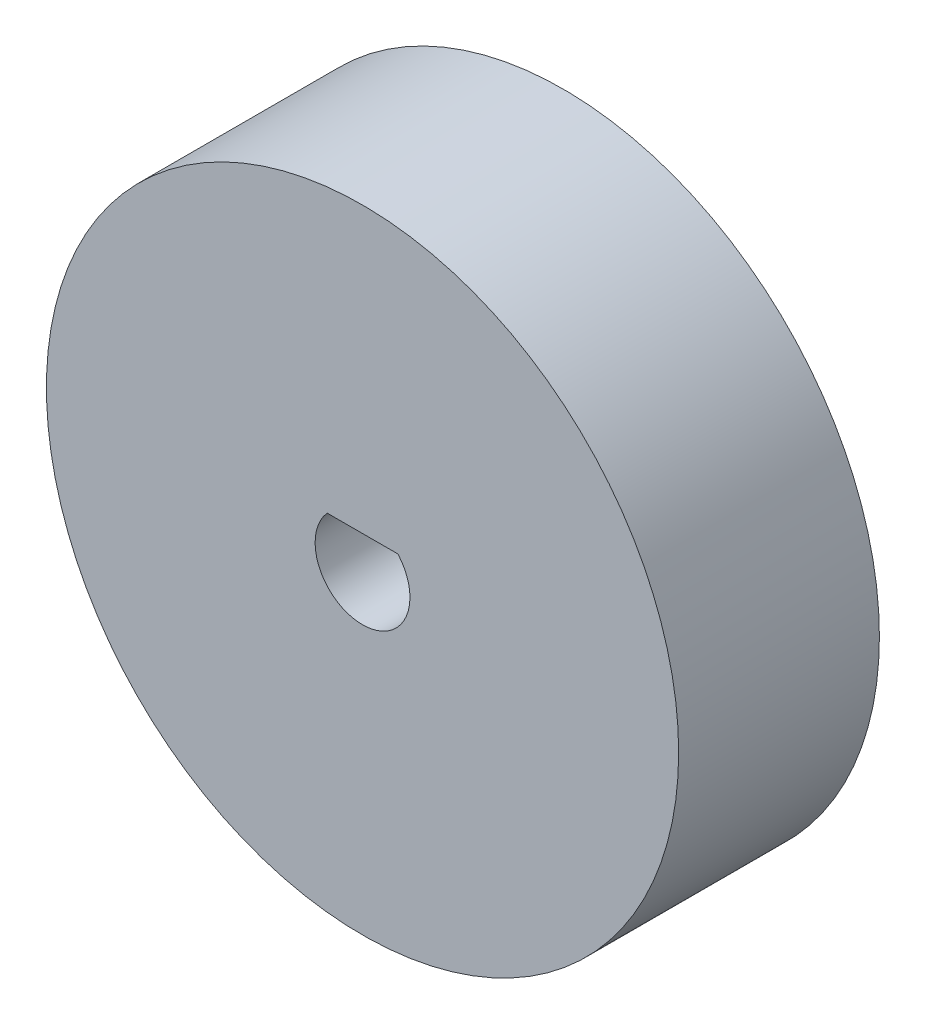
ISO-10303-21;
HEADER;
FILE_DESCRIPTION(('STEP AP214'),'2;1');
FILE_NAME('part.step','',(''),(''),'','','');
FILE_SCHEMA(('AUTOMOTIVE_DESIGN { 1 0 10303 214 1 1 1 1 }'));
ENDSEC;
DATA;
#1=APPLICATION_CONTEXT('core data for automotive mechanical design processes');
#2=APPLICATION_PROTOCOL_DEFINITION('international standard','automotive_design',2000,#1);
#3=PRODUCT_CONTEXT('',#1,'mechanical');
#4=PRODUCT('Part','Part','',(#3));
#5=PRODUCT_RELATED_PRODUCT_CATEGORY('part','',(#4));
#6=PRODUCT_DEFINITION_FORMATION('','',#4);
#7=PRODUCT_DEFINITION_CONTEXT('part definition',#1,'design');
#8=PRODUCT_DEFINITION('design','',#6,#7);
#9=PRODUCT_DEFINITION_SHAPE('','',#8);
#10=(LENGTH_UNIT() NAMED_UNIT(*) SI_UNIT(.MILLI.,.METRE.));
#11=(NAMED_UNIT(*) PLANE_ANGLE_UNIT() SI_UNIT($,.RADIAN.));
#12=(NAMED_UNIT(*) SI_UNIT($,.STERADIAN.) SOLID_ANGLE_UNIT());
#13=UNCERTAINTY_MEASURE_WITH_UNIT(LENGTH_MEASURE(1.E-05),#10,'distance_accuracy_value','');
#14=(GEOMETRIC_REPRESENTATION_CONTEXT(3) GLOBAL_UNCERTAINTY_ASSIGNED_CONTEXT((#13)) GLOBAL_UNIT_ASSIGNED_CONTEXT((#10,
#11,#12)) REPRESENTATION_CONTEXT('',''));
#15=CARTESIAN_POINT('',(0.,0.,0.));
#16=DIRECTION('',(0.,0.,1.));
#17=DIRECTION('',(1.,0.,0.));
#18=AXIS2_PLACEMENT_3D('',#15,#16,#17);
#19=CARTESIAN_POINT('',(0.,0.,6.35));
#20=DIRECTION('',(0.,0.,-1.));
#21=DIRECTION('',(-1.,0.,0.));
#22=AXIS2_PLACEMENT_3D('',#19,#20,#21);
#23=CYLINDRICAL_SURFACE('',#22,9.999999939);
#24=CARTESIAN_POINT('',(0.,0.,6.35));
#25=DIRECTION('',(0.,0.,1.));
#26=DIRECTION('',(1.,0.,0.));
#27=AXIS2_PLACEMENT_3D('',#24,#25,#26);
#28=CIRCLE('',#27,9.999999939);
#29=CARTESIAN_POINT('',(9.999999939,0.,6.35));
#30=VERTEX_POINT('',#29);
#31=EDGE_CURVE('E11',#30,#30,#28,.T.);
#32=ORIENTED_EDGE('',*,*,#31,.F.);
#33=EDGE_LOOP('',(#32));
#34=FACE_BOUND('',#33,.T.);
#35=CARTESIAN_POINT('',(0.,0.,0.));
#36=DIRECTION('',(0.,0.,1.));
#37=DIRECTION('',(1.,0.,0.));
#38=AXIS2_PLACEMENT_3D('',#35,#36,#37);
#39=CIRCLE('',#38,9.999999939);
#40=CARTESIAN_POINT('',(9.999999939,0.,0.));
#41=VERTEX_POINT('',#40);
#42=EDGE_CURVE('E40',#41,#41,#39,.T.);
#43=ORIENTED_EDGE('',*,*,#42,.T.);
#44=EDGE_LOOP('',(#43));
#45=FACE_BOUND('',#44,.T.);
#46=ADVANCED_FACE('F32',(#34,#45),#23,.T.);
#47=CARTESIAN_POINT('',(0.,0.,6.35));
#48=DIRECTION('',(0.,0.,1.));
#49=DIRECTION('',(1.,0.,0.));
#50=AXIS2_PLACEMENT_3D('',#47,#48,#49);
#51=PLANE('',#50);
#52=CARTESIAN_POINT('',(0.,0.,6.35));
#53=DIRECTION('',(0.,0.,1.));
#54=DIRECTION('',(1.,0.,0.));
#55=AXIS2_PLACEMENT_3D('',#52,#53,#54);
#56=CIRCLE('',#55,1.500000048);
#57=CARTESIAN_POINT('',(-1.11803402452698,1.000000032,6.35));
#58=VERTEX_POINT('',#57);
#59=CARTESIAN_POINT('',(1.11803402452698,1.000000032,6.35));
#60=VERTEX_POINT('',#59);
#61=EDGE_CURVE('E35',#58,#60,#56,.T.);
#62=ORIENTED_EDGE('',*,*,#61,.F.);
#63=DIRECTION('',(1.,0.,0.));
#64=VECTOR('',#63,1.);
#65=CARTESIAN_POINT('',(-1.11803402452698,1.000000032,6.35));
#66=LINE('',#65,#64);
#67=EDGE_CURVE('E74',#60,#58,#66,.F.);
#68=ORIENTED_EDGE('',*,*,#67,.F.);
#69=EDGE_LOOP('',(#62,#68));
#70=FACE_BOUND('',#69,.T.);
#71=ORIENTED_EDGE('',*,*,#31,.T.);
#72=EDGE_LOOP('',(#71));
#73=FACE_BOUND('',#72,.T.);
#74=ADVANCED_FACE('F78',(#70,#73),#51,.T.);
#75=CARTESIAN_POINT('',(0.,0.,0.));
#76=DIRECTION('',(0.,0.,1.));
#77=DIRECTION('',(1.,0.,0.));
#78=AXIS2_PLACEMENT_3D('',#75,#76,#77);
#79=PLANE('',#78);
#80=DIRECTION('',(-1.,0.,0.));
#81=VECTOR('',#80,1.);
#82=CARTESIAN_POINT('',(-1.11803402452698,1.000000032,0.));
#83=LINE('',#82,#81);
#84=CARTESIAN_POINT('',(1.11803402452698,1.000000032,0.));
#85=VERTEX_POINT('',#84);
#86=CARTESIAN_POINT('',(-1.11803402452698,1.000000032,0.));
#87=VERTEX_POINT('',#86);
#88=EDGE_CURVE('E64',#85,#87,#83,.T.);
#89=ORIENTED_EDGE('',*,*,#88,.T.);
#90=CARTESIAN_POINT('',(0.,0.,0.));
#91=DIRECTION('',(0.,0.,1.));
#92=DIRECTION('',(1.,0.,0.));
#93=AXIS2_PLACEMENT_3D('',#90,#91,#92);
#94=CIRCLE('',#93,1.500000048);
#95=EDGE_CURVE('E56',#87,#85,#94,.T.);
#96=ORIENTED_EDGE('',*,*,#95,.T.);
#97=EDGE_LOOP('',(#89,#96));
#98=FACE_BOUND('',#97,.T.);
#99=ORIENTED_EDGE('',*,*,#42,.F.);
#100=EDGE_LOOP('',(#99));
#101=FACE_BOUND('',#100,.T.);
#102=ADVANCED_FACE('F70',(#98,#101),#79,.F.);
#103=CARTESIAN_POINT('',(0.,0.,0.));
#104=DIRECTION('',(0.,0.,1.));
#105=DIRECTION('',(1.,0.,0.));
#106=AXIS2_PLACEMENT_3D('',#103,#104,#105);
#107=CYLINDRICAL_SURFACE('',#106,1.500000048);
#108=ORIENTED_EDGE('',*,*,#61,.T.);
#109=DIRECTION('',(0.,0.,1.));
#110=VECTOR('',#109,1.);
#111=CARTESIAN_POINT('',(1.11803402452698,1.000000032,0.));
#112=LINE('',#111,#110);
#113=EDGE_CURVE('E48',#85,#60,#112,.T.);
#114=ORIENTED_EDGE('',*,*,#113,.F.);
#115=ORIENTED_EDGE('',*,*,#95,.F.);
#116=DIRECTION('',(0.,0.,1.));
#117=VECTOR('',#116,1.);
#118=CARTESIAN_POINT('',(-1.11803402452698,1.000000032,0.));
#119=LINE('',#118,#117);
#120=EDGE_CURVE('E63',#87,#58,#119,.T.);
#121=ORIENTED_EDGE('',*,*,#120,.T.);
#122=EDGE_LOOP('',(#108,#114,#115,#121));
#123=FACE_BOUND('',#122,.T.);
#124=ADVANCED_FACE('F60',(#123),#107,.F.);
#125=CARTESIAN_POINT('',(-1.11803402452698,1.000000032,0.));
#126=DIRECTION('',(0.,1.,0.));
#127=DIRECTION('',(0.,0.,1.));
#128=AXIS2_PLACEMENT_3D('',#125,#126,#127);
#129=PLANE('',#128);
#130=ORIENTED_EDGE('',*,*,#67,.T.);
#131=ORIENTED_EDGE('',*,*,#120,.F.);
#132=ORIENTED_EDGE('',*,*,#88,.F.);
#133=ORIENTED_EDGE('',*,*,#113,.T.);
#134=EDGE_LOOP('',(#130,#131,#132,#133));
#135=FACE_BOUND('',#134,.T.);
#136=ADVANCED_FACE('F67',(#135),#129,.F.);
#137=CLOSED_SHELL('',(#46,#74,#102,#124,#136));
#138=MANIFOLD_SOLID_BREP('B2',#137);
#139=ADVANCED_BREP_SHAPE_REPRESENTATION('',(#18,#138),#14);
#140=SHAPE_DEFINITION_REPRESENTATION(#9,#139);
ENDSEC;
END-ISO-10303-21;
